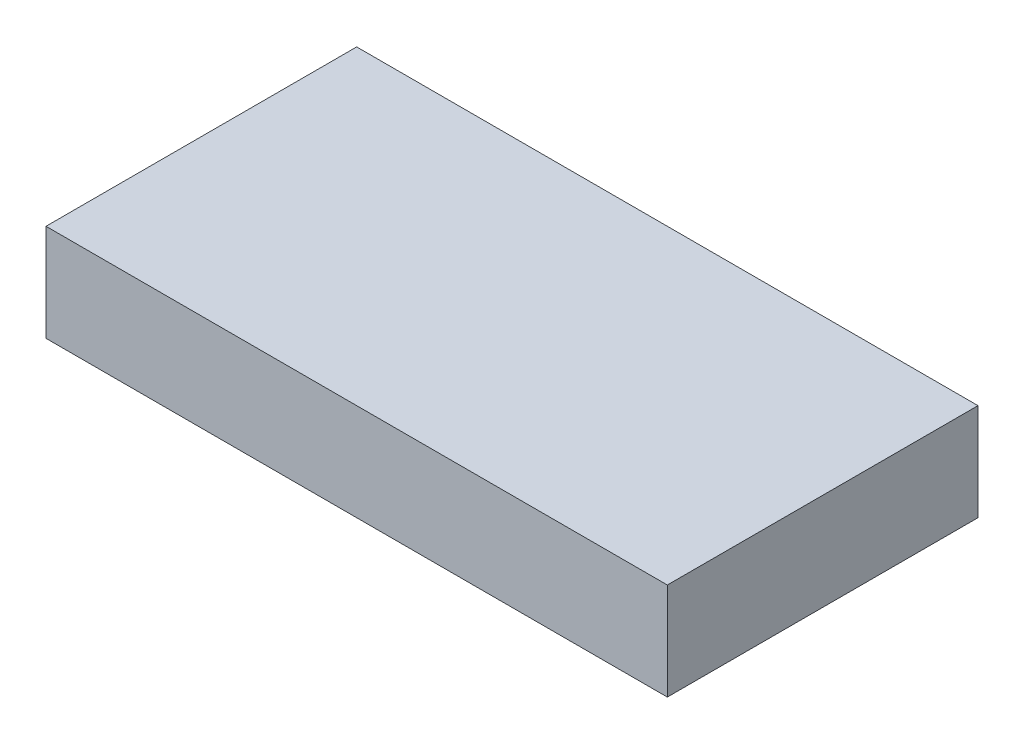
ISO-10303-21;
HEADER;
FILE_DESCRIPTION(('STEP AP214'),'2;1');
FILE_NAME('part.step','',(''),(''),'','','');
FILE_SCHEMA(('AUTOMOTIVE_DESIGN { 1 0 10303 214 1 1 1 1 }'));
ENDSEC;
DATA;
#1=APPLICATION_CONTEXT('core data for automotive mechanical design processes');
#2=APPLICATION_PROTOCOL_DEFINITION('international standard','automotive_design',2000,#1);
#3=PRODUCT_CONTEXT('',#1,'mechanical');
#4=PRODUCT('Part','Part','',(#3));
#5=PRODUCT_RELATED_PRODUCT_CATEGORY('part','',(#4));
#6=PRODUCT_DEFINITION_FORMATION('','',#4);
#7=PRODUCT_DEFINITION_CONTEXT('part definition',#1,'design');
#8=PRODUCT_DEFINITION('design','',#6,#7);
#9=PRODUCT_DEFINITION_SHAPE('','',#8);
#10=(LENGTH_UNIT() NAMED_UNIT(*) SI_UNIT(.MILLI.,.METRE.));
#11=(NAMED_UNIT(*) PLANE_ANGLE_UNIT() SI_UNIT($,.RADIAN.));
#12=(NAMED_UNIT(*) SI_UNIT($,.STERADIAN.) SOLID_ANGLE_UNIT());
#13=UNCERTAINTY_MEASURE_WITH_UNIT(LENGTH_MEASURE(1.E-05),#10,'distance_accuracy_value','');
#14=(GEOMETRIC_REPRESENTATION_CONTEXT(3) GLOBAL_UNCERTAINTY_ASSIGNED_CONTEXT((#13)) GLOBAL_UNIT_ASSIGNED_CONTEXT((#10,
#11,#12)) REPRESENTATION_CONTEXT('',''));
#15=CARTESIAN_POINT('',(0.,0.,0.));
#16=DIRECTION('',(0.,0.,1.));
#17=DIRECTION('',(1.,0.,0.));
#18=AXIS2_PLACEMENT_3D('',#15,#16,#17);
#19=CARTESIAN_POINT('',(-17.4169741697417,5.,-13.4317343173432));
#20=DIRECTION('',(1.,0.,0.));
#21=DIRECTION('',(0.,0.,-1.));
#22=AXIS2_PLACEMENT_3D('',#19,#20,#21);
#23=PLANE('',#22);
#24=DIRECTION('',(0.,0.,1.));
#25=VECTOR('',#24,1.);
#26=CARTESIAN_POINT('',(-17.4169741697417,0.,-13.4317343173432));
#27=LINE('',#26,#25);
#28=CARTESIAN_POINT('',(-17.4169741697417,0.,-13.4317343173432));
#29=VERTEX_POINT('',#28);
#30=CARTESIAN_POINT('',(-17.4169741697417,0.,2.56826568265683));
#31=VERTEX_POINT('',#30);
#32=EDGE_CURVE('E113',#29,#31,#27,.T.);
#33=ORIENTED_EDGE('',*,*,#32,.T.);
#34=DIRECTION('',(0.,-1.,0.));
#35=VECTOR('',#34,1.);
#36=CARTESIAN_POINT('',(-17.4169741697417,5.,2.56826568265683));
#37=LINE('',#36,#35);
#38=CARTESIAN_POINT('',(-17.4169741697417,5.,2.56826568265683));
#39=VERTEX_POINT('',#38);
#40=EDGE_CURVE('E11',#39,#31,#37,.T.);
#41=ORIENTED_EDGE('',*,*,#40,.F.);
#42=DIRECTION('',(0.,0.,1.));
#43=VECTOR('',#42,1.);
#44=CARTESIAN_POINT('',(-17.4169741697417,5.,-13.4317343173432));
#45=LINE('',#44,#43);
#46=CARTESIAN_POINT('',(-17.4169741697417,5.,-13.4317343173432));
#47=VERTEX_POINT('',#46);
#48=EDGE_CURVE('E97',#47,#39,#45,.T.);
#49=ORIENTED_EDGE('',*,*,#48,.F.);
#50=DIRECTION('',(0.,-1.,0.));
#51=VECTOR('',#50,1.);
#52=CARTESIAN_POINT('',(-17.4169741697417,5.,-13.4317343173432));
#53=LINE('',#52,#51);
#54=EDGE_CURVE('E109',#47,#29,#53,.T.);
#55=ORIENTED_EDGE('',*,*,#54,.T.);
#56=EDGE_LOOP('',(#33,#41,#49,#55));
#57=FACE_BOUND('',#56,.T.);
#58=ADVANCED_FACE('F45',(#57),#23,.F.);
#59=CARTESIAN_POINT('',(-17.4169741697417,5.,2.56826568265683));
#60=DIRECTION('',(0.,0.,-1.));
#61=DIRECTION('',(-1.,0.,0.));
#62=AXIS2_PLACEMENT_3D('',#59,#60,#61);
#63=PLANE('',#62);
#64=DIRECTION('',(1.,0.,0.));
#65=VECTOR('',#64,1.);
#66=CARTESIAN_POINT('',(-17.4169741697417,0.,2.56826568265683));
#67=LINE('',#66,#65);
#68=CARTESIAN_POINT('',(14.5830258302583,0.,2.56826568265683));
#69=VERTEX_POINT('',#68);
#70=EDGE_CURVE('E102',#31,#69,#67,.T.);
#71=ORIENTED_EDGE('',*,*,#70,.T.);
#72=DIRECTION('',(0.,-1.,0.));
#73=VECTOR('',#72,1.);
#74=CARTESIAN_POINT('',(14.5830258302583,5.,2.56826568265683));
#75=LINE('',#74,#73);
#76=CARTESIAN_POINT('',(14.5830258302583,5.,2.56826568265683));
#77=VERTEX_POINT('',#76);
#78=EDGE_CURVE('E54',#77,#69,#75,.T.);
#79=ORIENTED_EDGE('',*,*,#78,.F.);
#80=DIRECTION('',(1.,0.,0.));
#81=VECTOR('',#80,1.);
#82=CARTESIAN_POINT('',(-17.4169741697417,5.,2.56826568265683));
#83=LINE('',#82,#81);
#84=EDGE_CURVE('E92',#39,#77,#83,.T.);
#85=ORIENTED_EDGE('',*,*,#84,.F.);
#86=ORIENTED_EDGE('',*,*,#40,.T.);
#87=EDGE_LOOP('',(#71,#79,#85,#86));
#88=FACE_BOUND('',#87,.T.);
#89=ADVANCED_FACE('F101',(#88),#63,.F.);
#90=CARTESIAN_POINT('',(14.5830258302583,5.,-13.4317343173432));
#91=DIRECTION('',(-1.,0.,0.));
#92=DIRECTION('',(0.,0.,1.));
#93=AXIS2_PLACEMENT_3D('',#90,#91,#92);
#94=PLANE('',#93);
#95=DIRECTION('',(0.,0.,-1.));
#96=VECTOR('',#95,1.);
#97=CARTESIAN_POINT('',(14.5830258302583,0.,-13.4317343173432));
#98=LINE('',#97,#96);
#99=CARTESIAN_POINT('',(14.5830258302583,0.,-13.4317343173432));
#100=VERTEX_POINT('',#99);
#101=EDGE_CURVE('E79',#69,#100,#98,.T.);
#102=ORIENTED_EDGE('',*,*,#101,.T.);
#103=DIRECTION('',(0.,-1.,0.));
#104=VECTOR('',#103,1.);
#105=CARTESIAN_POINT('',(14.5830258302583,5.,-13.4317343173432));
#106=LINE('',#105,#104);
#107=CARTESIAN_POINT('',(14.5830258302583,5.,-13.4317343173432));
#108=VERTEX_POINT('',#107);
#109=EDGE_CURVE('E104',#108,#100,#106,.T.);
#110=ORIENTED_EDGE('',*,*,#109,.F.);
#111=DIRECTION('',(0.,0.,-1.));
#112=VECTOR('',#111,1.);
#113=CARTESIAN_POINT('',(14.5830258302583,5.,-13.4317343173432));
#114=LINE('',#113,#112);
#115=EDGE_CURVE('E95',#77,#108,#114,.T.);
#116=ORIENTED_EDGE('',*,*,#115,.F.);
#117=ORIENTED_EDGE('',*,*,#78,.T.);
#118=EDGE_LOOP('',(#102,#110,#116,#117));
#119=FACE_BOUND('',#118,.T.);
#120=ADVANCED_FACE('F105',(#119),#94,.F.);
#121=CARTESIAN_POINT('',(-17.4169741697417,5.,-13.4317343173432));
#122=DIRECTION('',(0.,0.,1.));
#123=DIRECTION('',(1.,0.,0.));
#124=AXIS2_PLACEMENT_3D('',#121,#122,#123);
#125=PLANE('',#124);
#126=DIRECTION('',(-1.,0.,0.));
#127=VECTOR('',#126,1.);
#128=CARTESIAN_POINT('',(-17.4169741697417,0.,-13.4317343173432));
#129=LINE('',#128,#127);
#130=EDGE_CURVE('E85',#100,#29,#129,.T.);
#131=ORIENTED_EDGE('',*,*,#130,.T.);
#132=ORIENTED_EDGE('',*,*,#54,.F.);
#133=DIRECTION('',(-1.,0.,0.));
#134=VECTOR('',#133,1.);
#135=CARTESIAN_POINT('',(-17.4169741697417,5.,-13.4317343173432));
#136=LINE('',#135,#134);
#137=EDGE_CURVE('E62',#108,#47,#136,.T.);
#138=ORIENTED_EDGE('',*,*,#137,.F.);
#139=ORIENTED_EDGE('',*,*,#109,.T.);
#140=EDGE_LOOP('',(#131,#132,#138,#139));
#141=FACE_BOUND('',#140,.T.);
#142=ADVANCED_FACE('F126',(#141),#125,.F.);
#143=CARTESIAN_POINT('',(0.,5.,0.));
#144=DIRECTION('',(0.,1.,0.));
#145=DIRECTION('',(0.,0.,1.));
#146=AXIS2_PLACEMENT_3D('',#143,#144,#145);
#147=PLANE('',#146);
#148=ORIENTED_EDGE('',*,*,#48,.T.);
#149=ORIENTED_EDGE('',*,*,#84,.T.);
#150=ORIENTED_EDGE('',*,*,#115,.T.);
#151=ORIENTED_EDGE('',*,*,#137,.T.);
#152=EDGE_LOOP('',(#148,#149,#150,#151));
#153=FACE_BOUND('',#152,.T.);
#154=ADVANCED_FACE('F93',(#153),#147,.T.);
#155=CARTESIAN_POINT('',(0.,0.,0.));
#156=DIRECTION('',(0.,1.,0.));
#157=DIRECTION('',(0.,0.,1.));
#158=AXIS2_PLACEMENT_3D('',#155,#156,#157);
#159=PLANE('',#158);
#160=ORIENTED_EDGE('',*,*,#32,.F.);
#161=ORIENTED_EDGE('',*,*,#130,.F.);
#162=ORIENTED_EDGE('',*,*,#101,.F.);
#163=ORIENTED_EDGE('',*,*,#70,.F.);
#164=EDGE_LOOP('',(#160,#161,#162,#163));
#165=FACE_BOUND('',#164,.T.);
#166=ADVANCED_FACE('F129',(#165),#159,.F.);
#167=CLOSED_SHELL('',(#58,#89,#120,#142,#154,#166));
#168=MANIFOLD_SOLID_BREP('B2',#167);
#169=ADVANCED_BREP_SHAPE_REPRESENTATION('',(#18,#168),#14);
#170=SHAPE_DEFINITION_REPRESENTATION(#9,#169);
ENDSEC;
END-ISO-10303-21;
